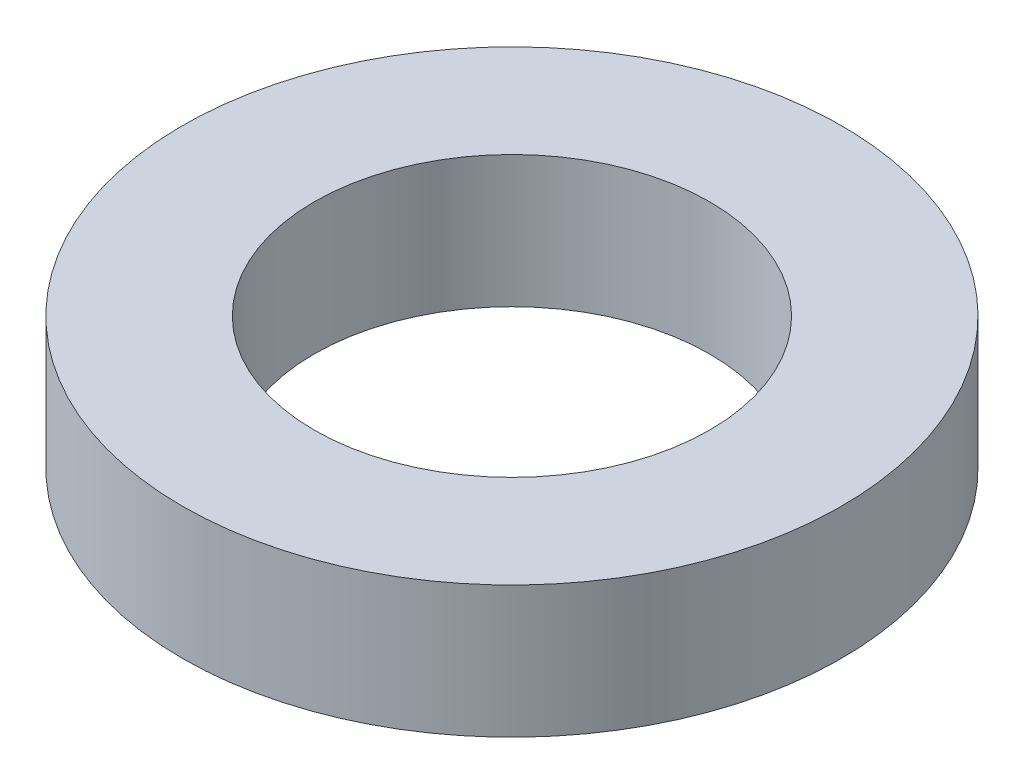
ISO-10303-21;
HEADER;
FILE_DESCRIPTION(('STEP AP214'),'2;1');
FILE_NAME('part.step','',(''),(''),'','','');
FILE_SCHEMA(('AUTOMOTIVE_DESIGN { 1 0 10303 214 1 1 1 1 }'));
ENDSEC;
DATA;
#1=APPLICATION_CONTEXT('core data for automotive mechanical design processes');
#2=APPLICATION_PROTOCOL_DEFINITION('international standard','automotive_design',2000,#1);
#3=PRODUCT_CONTEXT('',#1,'mechanical');
#4=PRODUCT('Part','Part','',(#3));
#5=PRODUCT_RELATED_PRODUCT_CATEGORY('part','',(#4));
#6=PRODUCT_DEFINITION_FORMATION('','',#4);
#7=PRODUCT_DEFINITION_CONTEXT('part definition',#1,'design');
#8=PRODUCT_DEFINITION('design','',#6,#7);
#9=PRODUCT_DEFINITION_SHAPE('','',#8);
#10=(LENGTH_UNIT() NAMED_UNIT(*) SI_UNIT(.MILLI.,.METRE.));
#11=(NAMED_UNIT(*) PLANE_ANGLE_UNIT() SI_UNIT($,.RADIAN.));
#12=(NAMED_UNIT(*) SI_UNIT($,.STERADIAN.) SOLID_ANGLE_UNIT());
#13=UNCERTAINTY_MEASURE_WITH_UNIT(LENGTH_MEASURE(1.E-05),#10,'distance_accuracy_value','');
#14=(GEOMETRIC_REPRESENTATION_CONTEXT(3) GLOBAL_UNCERTAINTY_ASSIGNED_CONTEXT((#13)) GLOBAL_UNIT_ASSIGNED_CONTEXT((#10,
#11,#12)) REPRESENTATION_CONTEXT('',''));
#15=CARTESIAN_POINT('',(0.,0.,0.));
#16=DIRECTION('',(0.,0.,1.));
#17=DIRECTION('',(1.,0.,0.));
#18=AXIS2_PLACEMENT_3D('',#15,#16,#17);
#19=CARTESIAN_POINT('',(0.,1.,0.));
#20=DIRECTION('',(0.,1.,0.));
#21=DIRECTION('',(0.,0.,1.));
#22=AXIS2_PLACEMENT_3D('',#19,#20,#21);
#23=PLANE('',#22);
#24=CARTESIAN_POINT('',(0.,1.,0.));
#25=DIRECTION('',(0.,1.,0.));
#26=DIRECTION('',(0.,0.,1.));
#27=AXIS2_PLACEMENT_3D('',#24,#25,#26);
#28=CIRCLE('',#27,2.5);
#29=CARTESIAN_POINT('',(0.,1.,2.5));
#30=VERTEX_POINT('',#29);
#31=EDGE_CURVE('E10',#30,#30,#28,.T.);
#32=ORIENTED_EDGE('',*,*,#31,.T.);
#33=EDGE_LOOP('',(#32));
#34=FACE_BOUND('',#33,.T.);
#35=CARTESIAN_POINT('',(0.,1.,0.));
#36=DIRECTION('',(0.,1.,0.));
#37=DIRECTION('',(0.,0.,1.));
#38=AXIS2_PLACEMENT_3D('',#35,#36,#37);
#39=CIRCLE('',#38,1.5);
#40=CARTESIAN_POINT('',(0.,1.,1.5));
#41=VERTEX_POINT('',#40);
#42=EDGE_CURVE('E43',#41,#41,#39,.T.);
#43=ORIENTED_EDGE('',*,*,#42,.F.);
#44=EDGE_LOOP('',(#43));
#45=FACE_BOUND('',#44,.T.);
#46=ADVANCED_FACE('F32',(#34,#45),#23,.T.);
#47=CARTESIAN_POINT('',(0.,0.,0.));
#48=DIRECTION('',(0.,1.,0.));
#49=DIRECTION('',(0.,0.,1.));
#50=AXIS2_PLACEMENT_3D('',#47,#48,#49);
#51=PLANE('',#50);
#52=CARTESIAN_POINT('',(0.,0.,0.));
#53=DIRECTION('',(0.,1.,0.));
#54=DIRECTION('',(0.,0.,1.));
#55=AXIS2_PLACEMENT_3D('',#52,#53,#54);
#56=CIRCLE('',#55,2.5);
#57=CARTESIAN_POINT('',(0.,0.,2.5));
#58=VERTEX_POINT('',#57);
#59=EDGE_CURVE('E36',#58,#58,#56,.T.);
#60=ORIENTED_EDGE('',*,*,#59,.F.);
#61=EDGE_LOOP('',(#60));
#62=FACE_BOUND('',#61,.T.);
#63=CARTESIAN_POINT('',(0.,0.,0.));
#64=DIRECTION('',(0.,1.,0.));
#65=DIRECTION('',(0.,0.,1.));
#66=AXIS2_PLACEMENT_3D('',#63,#64,#65);
#67=CIRCLE('',#66,1.5);
#68=CARTESIAN_POINT('',(0.,0.,1.5));
#69=VERTEX_POINT('',#68);
#70=EDGE_CURVE('E45',#69,#69,#67,.T.);
#71=ORIENTED_EDGE('',*,*,#70,.T.);
#72=EDGE_LOOP('',(#71));
#73=FACE_BOUND('',#72,.T.);
#74=ADVANCED_FACE('F55',(#62,#73),#51,.F.);
#75=CARTESIAN_POINT('',(0.,1.,0.));
#76=DIRECTION('',(0.,-1.,0.));
#77=DIRECTION('',(0.,0.,-1.));
#78=AXIS2_PLACEMENT_3D('',#75,#76,#77);
#79=CYLINDRICAL_SURFACE('',#78,2.5);
#80=ORIENTED_EDGE('',*,*,#31,.F.);
#81=EDGE_LOOP('',(#80));
#82=FACE_BOUND('',#81,.T.);
#83=ORIENTED_EDGE('',*,*,#59,.T.);
#84=EDGE_LOOP('',(#83));
#85=FACE_BOUND('',#84,.T.);
#86=ADVANCED_FACE('F34',(#82,#85),#79,.T.);
#87=CARTESIAN_POINT('',(0.,1.,0.));
#88=DIRECTION('',(0.,-1.,0.));
#89=DIRECTION('',(0.,0.,-1.));
#90=AXIS2_PLACEMENT_3D('',#87,#88,#89);
#91=CYLINDRICAL_SURFACE('',#90,1.5);
#92=ORIENTED_EDGE('',*,*,#42,.T.);
#93=EDGE_LOOP('',(#92));
#94=FACE_BOUND('',#93,.T.);
#95=ORIENTED_EDGE('',*,*,#70,.F.);
#96=EDGE_LOOP('',(#95));
#97=FACE_BOUND('',#96,.T.);
#98=ADVANCED_FACE('F51',(#94,#97),#91,.F.);
#99=CLOSED_SHELL('',(#46,#74,#86,#98));
#100=MANIFOLD_SOLID_BREP('B2',#99);
#101=ADVANCED_BREP_SHAPE_REPRESENTATION('',(#18,#100),#14);
#102=SHAPE_DEFINITION_REPRESENTATION(#9,#101);
ENDSEC;
END-ISO-10303-21;
